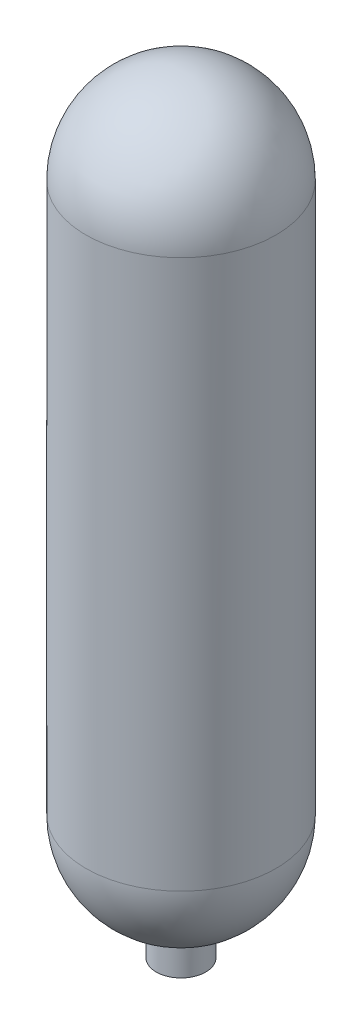
ISO-10303-21;
HEADER;
FILE_DESCRIPTION(('STEP AP214'),'2;1');
FILE_NAME('part.step','',(''),(''),'','','');
FILE_SCHEMA(('AUTOMOTIVE_DESIGN { 1 0 10303 214 1 1 1 1 }'));
ENDSEC;
DATA;
#1=APPLICATION_CONTEXT('core data for automotive mechanical design processes');
#2=APPLICATION_PROTOCOL_DEFINITION('international standard','automotive_design',2000,#1);
#3=PRODUCT_CONTEXT('',#1,'mechanical');
#4=PRODUCT('Part','Part','',(#3));
#5=PRODUCT_RELATED_PRODUCT_CATEGORY('part','',(#4));
#6=PRODUCT_DEFINITION_FORMATION('','',#4);
#7=PRODUCT_DEFINITION_CONTEXT('part definition',#1,'design');
#8=PRODUCT_DEFINITION('design','',#6,#7);
#9=PRODUCT_DEFINITION_SHAPE('','',#8);
#10=(LENGTH_UNIT() NAMED_UNIT(*) SI_UNIT(.MILLI.,.METRE.));
#11=(NAMED_UNIT(*) PLANE_ANGLE_UNIT() SI_UNIT($,.RADIAN.));
#12=(NAMED_UNIT(*) SI_UNIT($,.STERADIAN.) SOLID_ANGLE_UNIT());
#13=UNCERTAINTY_MEASURE_WITH_UNIT(LENGTH_MEASURE(1.E-05),#10,'distance_accuracy_value','');
#14=(GEOMETRIC_REPRESENTATION_CONTEXT(3) GLOBAL_UNCERTAINTY_ASSIGNED_CONTEXT((#13)) GLOBAL_UNIT_ASSIGNED_CONTEXT((#10,
#11,#12)) REPRESENTATION_CONTEXT('',''));
#15=CARTESIAN_POINT('',(0.,0.,0.));
#16=DIRECTION('',(0.,0.,1.));
#17=DIRECTION('',(1.,0.,0.));
#18=AXIS2_PLACEMENT_3D('',#15,#16,#17);
#19=CARTESIAN_POINT('',(0.,0.,0.));
#20=DIRECTION('',(0.,-1.,0.));
#21=DIRECTION('',(0.,0.,-1.));
#22=AXIS2_PLACEMENT_3D('',#19,#20,#21);
#23=PLANE('',#22);
#24=CARTESIAN_POINT('',(0.,0.,0.));
#25=DIRECTION('',(0.,-1.,0.));
#26=DIRECTION('',(0.,0.,-1.));
#27=AXIS2_PLACEMENT_3D('',#24,#25,#26);
#28=CIRCLE('',#27,8.24999999999999);
#29=CARTESIAN_POINT('',(0.,0.,-8.24999999999999));
#30=VERTEX_POINT('',#29);
#31=EDGE_CURVE('E58',#30,#30,#28,.T.);
#32=ORIENTED_EDGE('',*,*,#31,.F.);
#33=EDGE_LOOP('',(#32));
#34=FACE_BOUND('',#33,.T.);
#35=CARTESIAN_POINT('',(0.,0.,0.));
#36=DIRECTION('',(0.,-1.,0.));
#37=DIRECTION('',(0.,0.,-1.));
#38=AXIS2_PLACEMENT_3D('',#35,#36,#37);
#39=CIRCLE('',#38,15.);
#40=CARTESIAN_POINT('',(0.,0.,-15.));
#41=VERTEX_POINT('',#40);
#42=EDGE_CURVE('E46',#41,#41,#39,.T.);
#43=ORIENTED_EDGE('',*,*,#42,.T.);
#44=EDGE_LOOP('',(#43));
#45=FACE_BOUND('',#44,.T.);
#46=ADVANCED_FACE('F35',(#34,#45),#23,.T.);
#47=CARTESIAN_POINT('',(0.,0.,0.));
#48=DIRECTION('',(0.,-1.,0.));
#49=DIRECTION('',(0.,0.,-1.));
#50=AXIS2_PLACEMENT_3D('',#47,#48,#49);
#51=CYLINDRICAL_SURFACE('',#50,15.);
#52=CARTESIAN_POINT('',(0.,16.2954118663013,0.));
#53=DIRECTION('',(0.,1.,0.));
#54=DIRECTION('',(0.,0.,1.));
#55=AXIS2_PLACEMENT_3D('',#52,#53,#54);
#56=CIRCLE('',#55,15.);
#57=CARTESIAN_POINT('',(0.,16.2954118663013,15.));
#58=VERTEX_POINT('',#57);
#59=EDGE_CURVE('E42',#58,#58,#56,.F.);
#60=ORIENTED_EDGE('',*,*,#59,.T.);
#61=EDGE_LOOP('',(#60));
#62=FACE_BOUND('',#61,.T.);
#63=ORIENTED_EDGE('',*,*,#42,.F.);
#64=EDGE_LOOP('',(#63));
#65=FACE_BOUND('',#64,.T.);
#66=ADVANCED_FACE('F108',(#62,#65),#51,.T.);
#67=CARTESIAN_POINT('',(0.,75.5090082779364,0.));
#68=DIRECTION('',(0.,-1.,0.));
#69=DIRECTION('',(1.,0.,0.));
#70=AXIS2_PLACEMENT_3D('',#67,#68,#69);
#71=SPHERICAL_SURFACE('',#70,57.5);
#72=CARTESIAN_POINT('',(0.,21.0324995792321,0.));
#73=DIRECTION('',(0.,1.,0.));
#74=DIRECTION('',(0.,0.,1.));
#75=AXIS2_PLACEMENT_3D('',#72,#73,#74);
#76=CIRCLE('',#75,18.4);
#77=CARTESIAN_POINT('',(0.,21.0324995792321,18.4));
#78=VERTEX_POINT('',#77);
#79=EDGE_CURVE('E10',#78,#78,#76,.T.);
#80=ORIENTED_EDGE('',*,*,#79,.T.);
#81=EDGE_LOOP('',(#80));
#82=FACE_BOUND('',#81,.T.);
#83=CARTESIAN_POINT('',(0.,75.5090082779364,0.));
#84=DIRECTION('',(0.,-1.,0.));
#85=DIRECTION('',(0.,0.,-1.));
#86=AXIS2_PLACEMENT_3D('',#83,#84,#85);
#87=CIRCLE('',#86,57.5000000000001);
#88=CARTESIAN_POINT('',(0.,75.5090082779364,-57.5000000000001));
#89=VERTEX_POINT('',#88);
#90=EDGE_CURVE('E50',#89,#89,#87,.T.);
#91=ORIENTED_EDGE('',*,*,#90,.T.);
#92=EDGE_LOOP('',(#91));
#93=FACE_BOUND('',#92,.T.);
#94=ADVANCED_FACE('F113',(#82,#93),#71,.T.);
#95=CARTESIAN_POINT('',(0.,0.,0.));
#96=DIRECTION('',(0.,-1.,0.));
#97=DIRECTION('',(0.,0.,-1.));
#98=AXIS2_PLACEMENT_3D('',#95,#96,#97);
#99=CYLINDRICAL_SURFACE('',#98,57.5);
#100=CARTESIAN_POINT('',(0.,407.5,0.));
#101=DIRECTION('',(0.,-1.,0.));
#102=DIRECTION('',(0.,0.,-1.));
#103=AXIS2_PLACEMENT_3D('',#100,#101,#102);
#104=CIRCLE('',#103,57.5);
#105=CARTESIAN_POINT('',(0.,407.5,-57.5));
#106=VERTEX_POINT('',#105);
#107=EDGE_CURVE('E55',#106,#106,#104,.T.);
#108=ORIENTED_EDGE('',*,*,#107,.T.);
#109=EDGE_LOOP('',(#108));
#110=FACE_BOUND('',#109,.T.);
#111=ORIENTED_EDGE('',*,*,#90,.F.);
#112=EDGE_LOOP('',(#111));
#113=FACE_BOUND('',#112,.T.);
#114=ADVANCED_FACE('F104',(#110,#113),#99,.T.);
#115=CARTESIAN_POINT('',(0.,407.5,0.));
#116=DIRECTION('',(0.,-1.,0.));
#117=DIRECTION('',(1.,0.,0.));
#118=AXIS2_PLACEMENT_3D('',#115,#116,#117);
#119=SPHERICAL_SURFACE('',#118,57.5);
#120=ORIENTED_EDGE('',*,*,#107,.F.);
#121=EDGE_LOOP('',(#120));
#122=FACE_BOUND('',#121,.T.);
#123=ADVANCED_FACE('F96',(#122),#119,.T.);
#124=CARTESIAN_POINT('',(0.,0.,0.));
#125=DIRECTION('',(0.,-1.,0.));
#126=DIRECTION('',(0.,0.,-1.));
#127=AXIS2_PLACEMENT_3D('',#124,#125,#126);
#128=CYLINDRICAL_SURFACE('',#127,8.24999999999999);
#129=ORIENTED_EDGE('',*,*,#31,.T.);
#130=EDGE_LOOP('',(#129));
#131=FACE_BOUND('',#130,.T.);
#132=CARTESIAN_POINT('',(0.,25.7695872921629,0.));
#133=DIRECTION('',(0.,-1.,0.));
#134=DIRECTION('',(0.,0.,-1.));
#135=AXIS2_PLACEMENT_3D('',#132,#133,#134);
#136=CIRCLE('',#135,8.24999999999999);
#137=CARTESIAN_POINT('',(0.,25.7695872921629,-8.24999999999999));
#138=VERTEX_POINT('',#137);
#139=EDGE_CURVE('E61',#138,#138,#136,.T.);
#140=ORIENTED_EDGE('',*,*,#139,.F.);
#141=EDGE_LOOP('',(#140));
#142=FACE_BOUND('',#141,.T.);
#143=ADVANCED_FACE('F94',(#131,#142),#128,.F.);
#144=CARTESIAN_POINT('',(0.,16.2954118663013,0.));
#145=DIRECTION('',(0.,1.,0.));
#146=DIRECTION('',(0.,0.,1.));
#147=AXIS2_PLACEMENT_3D('',#144,#145,#146);
#148=TOROIDAL_SURFACE('',#147,20.,5.);
#149=ORIENTED_EDGE('',*,*,#79,.F.);
#150=EDGE_LOOP('',(#149));
#151=FACE_BOUND('',#150,.T.);
#152=ORIENTED_EDGE('',*,*,#59,.F.);
#153=EDGE_LOOP('',(#152));
#154=FACE_BOUND('',#153,.T.);
#155=ADVANCED_FACE('F37',(#151,#154),#148,.F.);
#156=CARTESIAN_POINT('',(8.24999999999999,25.7695872921629,0.));
#157=DIRECTION('',(0.,-1.,0.));
#158=DIRECTION('',(0.,0.,-1.));
#159=AXIS2_PLACEMENT_3D('',#156,#157,#158);
#160=PLANE('',#159);
#161=CARTESIAN_POINT('',(0.,25.7695872921629,0.));
#162=DIRECTION('',(0.,-1.,0.));
#163=DIRECTION('',(0.,0.,-1.));
#164=AXIS2_PLACEMENT_3D('',#161,#162,#163);
#165=CIRCLE('',#164,16.8);
#166=CARTESIAN_POINT('',(0.,25.7695872921629,-16.8));
#167=VERTEX_POINT('',#166);
#168=EDGE_CURVE('E64',#167,#167,#165,.T.);
#169=ORIENTED_EDGE('',*,*,#168,.F.);
#170=EDGE_LOOP('',(#169));
#171=FACE_BOUND('',#170,.T.);
#172=ORIENTED_EDGE('',*,*,#139,.T.);
#173=EDGE_LOOP('',(#172));
#174=FACE_BOUND('',#173,.T.);
#175=ADVANCED_FACE('F85',(#171,#174),#160,.F.);
#176=CARTESIAN_POINT('',(0.,75.5090082779364,0.));
#177=DIRECTION('',(0.,-1.,0.));
#178=DIRECTION('',(1.,0.,0.));
#179=AXIS2_PLACEMENT_3D('',#176,#177,#178);
#180=SPHERICAL_SURFACE('',#179,52.5);
#181=CARTESIAN_POINT('',(0.,75.5090082779364,0.));
#182=DIRECTION('',(0.,-1.,0.));
#183=DIRECTION('',(0.,0.,-1.));
#184=AXIS2_PLACEMENT_3D('',#181,#182,#183);
#185=CIRCLE('',#184,52.5000000000001);
#186=CARTESIAN_POINT('',(0.,75.5090082779364,-52.5000000000001));
#187=VERTEX_POINT('',#186);
#188=EDGE_CURVE('E67',#187,#187,#185,.T.);
#189=ORIENTED_EDGE('',*,*,#188,.F.);
#190=EDGE_LOOP('',(#189));
#191=FACE_BOUND('',#190,.T.);
#192=ORIENTED_EDGE('',*,*,#168,.T.);
#193=EDGE_LOOP('',(#192));
#194=FACE_BOUND('',#193,.T.);
#195=ADVANCED_FACE('F79',(#191,#194),#180,.F.);
#196=CARTESIAN_POINT('',(0.,0.,0.));
#197=DIRECTION('',(0.,-1.,0.));
#198=DIRECTION('',(0.,0.,-1.));
#199=AXIS2_PLACEMENT_3D('',#196,#197,#198);
#200=CYLINDRICAL_SURFACE('',#199,52.5);
#201=CARTESIAN_POINT('',(0.,407.5,0.));
#202=DIRECTION('',(0.,-1.,0.));
#203=DIRECTION('',(0.,0.,-1.));
#204=AXIS2_PLACEMENT_3D('',#201,#202,#203);
#205=CIRCLE('',#204,52.5);
#206=CARTESIAN_POINT('',(0.,407.5,-52.5));
#207=VERTEX_POINT('',#206);
#208=EDGE_CURVE('E70',#207,#207,#205,.T.);
#209=ORIENTED_EDGE('',*,*,#208,.F.);
#210=EDGE_LOOP('',(#209));
#211=FACE_BOUND('',#210,.T.);
#212=ORIENTED_EDGE('',*,*,#188,.T.);
#213=EDGE_LOOP('',(#212));
#214=FACE_BOUND('',#213,.T.);
#215=ADVANCED_FACE('F76',(#211,#214),#200,.F.);
#216=CARTESIAN_POINT('',(0.,407.5,0.));
#217=DIRECTION('',(0.,-1.,0.));
#218=DIRECTION('',(1.,0.,0.));
#219=AXIS2_PLACEMENT_3D('',#216,#217,#218);
#220=SPHERICAL_SURFACE('',#219,52.5);
#221=ORIENTED_EDGE('',*,*,#208,.T.);
#222=EDGE_LOOP('',(#221));
#223=FACE_BOUND('',#222,.T.);
#224=ADVANCED_FACE('F74',(#223),#220,.F.);
#225=CLOSED_SHELL('',(#46,#66,#94,#114,#123,#143,#155,#175,#195,#215,#224));
#226=MANIFOLD_SOLID_BREP('B2',#225);
#227=ADVANCED_BREP_SHAPE_REPRESENTATION('',(#18,#226),#14);
#228=SHAPE_DEFINITION_REPRESENTATION(#9,#227);
ENDSEC;
END-ISO-10303-21;
